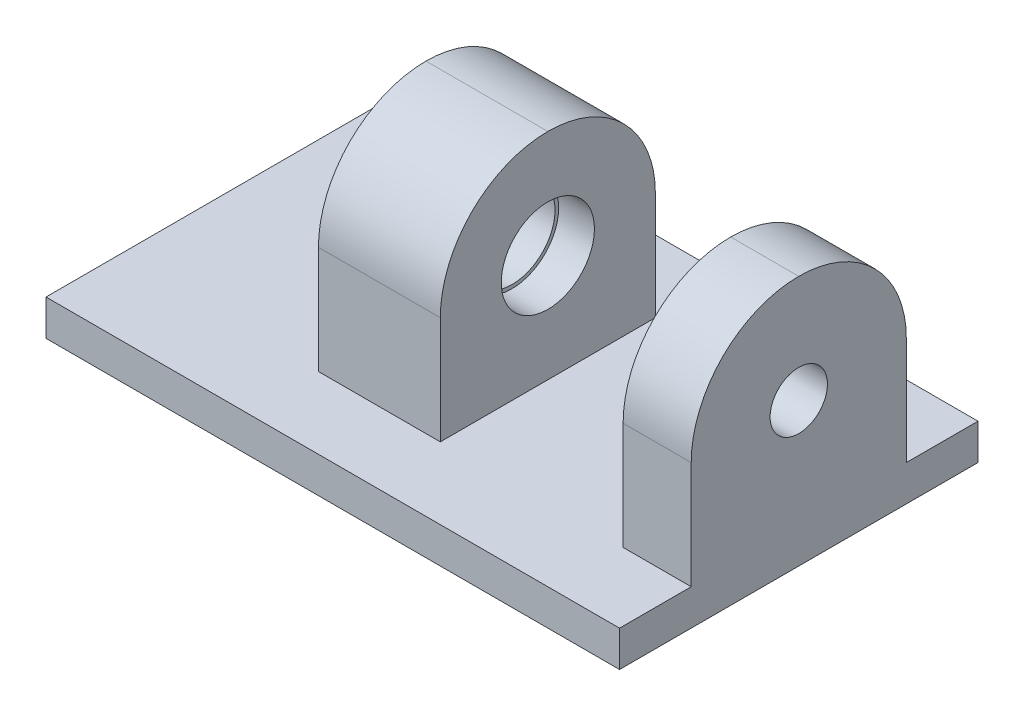
ISO-10303-21;
HEADER;
FILE_DESCRIPTION(('STEP AP214'),'2;1');
FILE_NAME('part.step','',(''),(''),'','','');
FILE_SCHEMA(('AUTOMOTIVE_DESIGN { 1 0 10303 214 1 1 1 1 }'));
ENDSEC;
DATA;
#1=APPLICATION_CONTEXT('core data for automotive mechanical design processes');
#2=APPLICATION_PROTOCOL_DEFINITION('international standard','automotive_design',2000,#1);
#3=PRODUCT_CONTEXT('',#1,'mechanical');
#4=PRODUCT('Part','Part','',(#3));
#5=PRODUCT_RELATED_PRODUCT_CATEGORY('part','',(#4));
#6=PRODUCT_DEFINITION_FORMATION('','',#4);
#7=PRODUCT_DEFINITION_CONTEXT('part definition',#1,'design');
#8=PRODUCT_DEFINITION('design','',#6,#7);
#9=PRODUCT_DEFINITION_SHAPE('','',#8);
#10=(LENGTH_UNIT() NAMED_UNIT(*) SI_UNIT(.MILLI.,.METRE.));
#11=(NAMED_UNIT(*) PLANE_ANGLE_UNIT() SI_UNIT($,.RADIAN.));
#12=(NAMED_UNIT(*) SI_UNIT($,.STERADIAN.) SOLID_ANGLE_UNIT());
#13=UNCERTAINTY_MEASURE_WITH_UNIT(LENGTH_MEASURE(1.E-05),#10,'distance_accuracy_value','');
#14=(GEOMETRIC_REPRESENTATION_CONTEXT(3) GLOBAL_UNCERTAINTY_ASSIGNED_CONTEXT((#13)) GLOBAL_UNIT_ASSIGNED_CONTEXT((#10,
#11,#12)) REPRESENTATION_CONTEXT('',''));
#15=CARTESIAN_POINT('',(0.,0.,0.));
#16=DIRECTION('',(0.,0.,1.));
#17=DIRECTION('',(1.,0.,0.));
#18=AXIS2_PLACEMENT_3D('',#15,#16,#17);
#19=CARTESIAN_POINT('',(0.,5.,0.));
#20=DIRECTION('',(0.,-1.,0.));
#21=DIRECTION('',(0.,0.,-1.));
#22=AXIS2_PLACEMENT_3D('',#19,#20,#21);
#23=PLANE('',#22);
#24=DIRECTION('',(0.,0.,-1.));
#25=VECTOR('',#24,1.);
#26=CARTESIAN_POINT('',(5.,5.,15.));
#27=LINE('',#26,#25);
#28=CARTESIAN_POINT('',(5.,5.,15.));
#29=VERTEX_POINT('',#28);
#30=CARTESIAN_POINT('',(5.,5.,-15.));
#31=VERTEX_POINT('',#30);
#32=EDGE_CURVE('E142',#29,#31,#27,.T.);
#33=ORIENTED_EDGE('',*,*,#32,.F.);
#34=DIRECTION('',(1.,0.,0.));
#35=VECTOR('',#34,1.);
#36=CARTESIAN_POINT('',(-12.,5.,15.));
#37=LINE('',#36,#35);
#38=CARTESIAN_POINT('',(-12.,5.,15.));
#39=VERTEX_POINT('',#38);
#40=EDGE_CURVE('E186',#39,#29,#37,.T.);
#41=ORIENTED_EDGE('',*,*,#40,.F.);
#42=DIRECTION('',(0.,0.,1.));
#43=VECTOR('',#42,1.);
#44=CARTESIAN_POINT('',(-12.,5.,15.));
#45=LINE('',#44,#43);
#46=CARTESIAN_POINT('',(-12.,5.,-15.));
#47=VERTEX_POINT('',#46);
#48=EDGE_CURVE('E183',#47,#39,#45,.T.);
#49=ORIENTED_EDGE('',*,*,#48,.F.);
#50=DIRECTION('',(-1.,0.,0.));
#51=VECTOR('',#50,1.);
#52=CARTESIAN_POINT('',(-12.,5.,-15.));
#53=LINE('',#52,#51);
#54=EDGE_CURVE('E180',#31,#47,#53,.T.);
#55=ORIENTED_EDGE('',*,*,#54,.F.);
#56=EDGE_LOOP('',(#33,#41,#49,#55));
#57=FACE_BOUND('',#56,.T.);
#58=DIRECTION('',(-1.,0.,0.));
#59=VECTOR('',#58,1.);
#60=CARTESIAN_POINT('',(30.5,5.,-15.));
#61=LINE('',#60,#59);
#62=CARTESIAN_POINT('',(40.,5.,-15.));
#63=VERTEX_POINT('',#62);
#64=CARTESIAN_POINT('',(30.5,5.,-15.));
#65=VERTEX_POINT('',#64);
#66=EDGE_CURVE('E139',#63,#65,#61,.T.);
#67=ORIENTED_EDGE('',*,*,#66,.F.);
#68=DIRECTION('',(0.,0.,-1.));
#69=VECTOR('',#68,1.);
#70=CARTESIAN_POINT('',(40.,5.,25.));
#71=LINE('',#70,#69);
#72=CARTESIAN_POINT('',(40.,5.,-25.));
#73=VERTEX_POINT('',#72);
#74=EDGE_CURVE('E146',#63,#73,#71,.T.);
#75=ORIENTED_EDGE('',*,*,#74,.T.);
#76=DIRECTION('',(-1.,0.,0.));
#77=VECTOR('',#76,1.);
#78=CARTESIAN_POINT('',(-40.,5.,-25.));
#79=LINE('',#78,#77);
#80=CARTESIAN_POINT('',(-40.,5.,-25.));
#81=VERTEX_POINT('',#80);
#82=EDGE_CURVE('E199',#73,#81,#79,.T.);
#83=ORIENTED_EDGE('',*,*,#82,.T.);
#84=DIRECTION('',(0.,0.,1.));
#85=VECTOR('',#84,1.);
#86=CARTESIAN_POINT('',(-40.,5.,25.));
#87=LINE('',#86,#85);
#88=CARTESIAN_POINT('',(-40.,5.,25.));
#89=VERTEX_POINT('',#88);
#90=EDGE_CURVE('E201',#81,#89,#87,.T.);
#91=ORIENTED_EDGE('',*,*,#90,.T.);
#92=DIRECTION('',(1.,0.,0.));
#93=VECTOR('',#92,1.);
#94=CARTESIAN_POINT('',(-40.,5.,25.));
#95=LINE('',#94,#93);
#96=CARTESIAN_POINT('',(40.,5.,25.));
#97=VERTEX_POINT('',#96);
#98=EDGE_CURVE('E203',#89,#97,#95,.T.);
#99=ORIENTED_EDGE('',*,*,#98,.T.);
#100=CARTESIAN_POINT('',(40.,5.,15.));
#101=VERTEX_POINT('',#100);
#102=EDGE_CURVE('E153',#97,#101,#71,.T.);
#103=ORIENTED_EDGE('',*,*,#102,.T.);
#104=DIRECTION('',(1.,0.,0.));
#105=VECTOR('',#104,1.);
#106=CARTESIAN_POINT('',(30.5,5.,15.));
#107=LINE('',#106,#105);
#108=CARTESIAN_POINT('',(30.5,5.,15.));
#109=VERTEX_POINT('',#108);
#110=EDGE_CURVE('E162',#109,#101,#107,.T.);
#111=ORIENTED_EDGE('',*,*,#110,.F.);
#112=DIRECTION('',(0.,0.,1.));
#113=VECTOR('',#112,1.);
#114=CARTESIAN_POINT('',(30.5,5.,15.));
#115=LINE('',#114,#113);
#116=EDGE_CURVE('E159',#65,#109,#115,.T.);
#117=ORIENTED_EDGE('',*,*,#116,.F.);
#118=EDGE_LOOP('',(#67,#75,#83,#91,#99,#103,#111,#117));
#119=FACE_BOUND('',#118,.T.);
#120=ADVANCED_FACE('F35',(#57,#119),#23,.F.);
#121=CARTESIAN_POINT('',(40.,5.,25.));
#122=DIRECTION('',(-1.,0.,0.));
#123=DIRECTION('',(0.,0.,1.));
#124=AXIS2_PLACEMENT_3D('',#121,#122,#123);
#125=PLANE('',#124);
#126=CARTESIAN_POINT('',(40.,20.,0.));
#127=DIRECTION('',(-1.,0.,0.));
#128=DIRECTION('',(0.,0.,1.));
#129=AXIS2_PLACEMENT_3D('',#126,#127,#128);
#130=CIRCLE('',#129,4.);
#131=CARTESIAN_POINT('',(40.,20.,3.99999999999999));
#132=VERTEX_POINT('',#131);
#133=EDGE_CURVE('E168',#132,#132,#130,.T.);
#134=ORIENTED_EDGE('',*,*,#133,.T.);
#135=EDGE_LOOP('',(#134));
#136=FACE_BOUND('',#135,.T.);
#137=DIRECTION('',(0.,-1.,0.));
#138=VECTOR('',#137,1.);
#139=CARTESIAN_POINT('',(40.,35.,-15.));
#140=LINE('',#139,#138);
#141=CARTESIAN_POINT('',(40.,20.,-15.));
#142=VERTEX_POINT('',#141);
#143=EDGE_CURVE('E134',#142,#63,#140,.T.);
#144=ORIENTED_EDGE('',*,*,#143,.F.);
#145=CARTESIAN_POINT('',(40.,20.,0.));
#146=DIRECTION('',(-1.,0.,0.));
#147=DIRECTION('',(0.,0.,1.));
#148=AXIS2_PLACEMENT_3D('',#145,#146,#147);
#149=CIRCLE('',#148,15.);
#150=CARTESIAN_POINT('',(40.,35.,0.));
#151=VERTEX_POINT('',#150);
#152=EDGE_CURVE('E44',#142,#151,#149,.F.);
#153=ORIENTED_EDGE('',*,*,#152,.T.);
#154=CARTESIAN_POINT('',(40.,20.,0.));
#155=DIRECTION('',(-1.,0.,0.));
#156=DIRECTION('',(0.,0.,1.));
#157=AXIS2_PLACEMENT_3D('',#154,#155,#156);
#158=CIRCLE('',#157,15.);
#159=CARTESIAN_POINT('',(40.,20.,15.));
#160=VERTEX_POINT('',#159);
#161=EDGE_CURVE('E52',#151,#160,#158,.F.);
#162=ORIENTED_EDGE('',*,*,#161,.T.);
#163=DIRECTION('',(0.,-1.,0.));
#164=VECTOR('',#163,1.);
#165=CARTESIAN_POINT('',(40.,35.,15.));
#166=LINE('',#165,#164);
#167=EDGE_CURVE('E173',#160,#101,#166,.T.);
#168=ORIENTED_EDGE('',*,*,#167,.T.);
#169=ORIENTED_EDGE('',*,*,#102,.F.);
#170=DIRECTION('',(0.,-1.,0.));
#171=VECTOR('',#170,1.);
#172=CARTESIAN_POINT('',(40.,5.,25.));
#173=LINE('',#172,#171);
#174=CARTESIAN_POINT('',(40.,0.,25.));
#175=VERTEX_POINT('',#174);
#176=EDGE_CURVE('E205',#97,#175,#173,.T.);
#177=ORIENTED_EDGE('',*,*,#176,.T.);
#178=DIRECTION('',(0.,0.,-1.));
#179=VECTOR('',#178,1.);
#180=CARTESIAN_POINT('',(40.,0.,25.));
#181=LINE('',#180,#179);
#182=CARTESIAN_POINT('',(40.,0.,-25.));
#183=VERTEX_POINT('',#182);
#184=EDGE_CURVE('E196',#175,#183,#181,.T.);
#185=ORIENTED_EDGE('',*,*,#184,.T.);
#186=DIRECTION('',(0.,-1.,0.));
#187=VECTOR('',#186,1.);
#188=CARTESIAN_POINT('',(40.,5.,-25.));
#189=LINE('',#188,#187);
#190=EDGE_CURVE('E150',#73,#183,#189,.T.);
#191=ORIENTED_EDGE('',*,*,#190,.F.);
#192=ORIENTED_EDGE('',*,*,#74,.F.);
#193=EDGE_LOOP('',(#144,#153,#162,#168,#169,#177,#185,#191,#192));
#194=FACE_BOUND('',#193,.T.);
#195=ADVANCED_FACE('F147',(#136,#194),#125,.F.);
#196=CARTESIAN_POINT('',(-40.,5.,-25.));
#197=DIRECTION('',(0.,0.,1.));
#198=DIRECTION('',(1.,0.,0.));
#199=AXIS2_PLACEMENT_3D('',#196,#197,#198);
#200=PLANE('',#199);
#201=DIRECTION('',(-1.,0.,0.));
#202=VECTOR('',#201,1.);
#203=CARTESIAN_POINT('',(-40.,0.,-25.));
#204=LINE('',#203,#202);
#205=CARTESIAN_POINT('',(-40.,0.,-25.));
#206=VERTEX_POINT('',#205);
#207=EDGE_CURVE('E207',#183,#206,#204,.T.);
#208=ORIENTED_EDGE('',*,*,#207,.T.);
#209=DIRECTION('',(0.,-1.,0.));
#210=VECTOR('',#209,1.);
#211=CARTESIAN_POINT('',(-40.,5.,-25.));
#212=LINE('',#211,#210);
#213=EDGE_CURVE('E217',#81,#206,#212,.T.);
#214=ORIENTED_EDGE('',*,*,#213,.F.);
#215=ORIENTED_EDGE('',*,*,#82,.F.);
#216=ORIENTED_EDGE('',*,*,#190,.T.);
#217=EDGE_LOOP('',(#208,#214,#215,#216));
#218=FACE_BOUND('',#217,.T.);
#219=ADVANCED_FACE('F325',(#218),#200,.F.);
#220=CARTESIAN_POINT('',(-40.,5.,25.));
#221=DIRECTION('',(1.,0.,0.));
#222=DIRECTION('',(0.,0.,-1.));
#223=AXIS2_PLACEMENT_3D('',#220,#221,#222);
#224=PLANE('',#223);
#225=DIRECTION('',(0.,0.,1.));
#226=VECTOR('',#225,1.);
#227=CARTESIAN_POINT('',(-40.,0.,25.));
#228=LINE('',#227,#226);
#229=CARTESIAN_POINT('',(-40.,0.,25.));
#230=VERTEX_POINT('',#229);
#231=EDGE_CURVE('E209',#206,#230,#228,.T.);
#232=ORIENTED_EDGE('',*,*,#231,.T.);
#233=DIRECTION('',(0.,-1.,0.));
#234=VECTOR('',#233,1.);
#235=CARTESIAN_POINT('',(-40.,5.,25.));
#236=LINE('',#235,#234);
#237=EDGE_CURVE('E214',#89,#230,#236,.T.);
#238=ORIENTED_EDGE('',*,*,#237,.F.);
#239=ORIENTED_EDGE('',*,*,#90,.F.);
#240=ORIENTED_EDGE('',*,*,#213,.T.);
#241=EDGE_LOOP('',(#232,#238,#239,#240));
#242=FACE_BOUND('',#241,.T.);
#243=ADVANCED_FACE('F335',(#242),#224,.F.);
#244=CARTESIAN_POINT('',(-40.,5.,25.));
#245=DIRECTION('',(0.,0.,-1.));
#246=DIRECTION('',(-1.,0.,0.));
#247=AXIS2_PLACEMENT_3D('',#244,#245,#246);
#248=PLANE('',#247);
#249=DIRECTION('',(1.,0.,0.));
#250=VECTOR('',#249,1.);
#251=CARTESIAN_POINT('',(-40.,0.,25.));
#252=LINE('',#251,#250);
#253=EDGE_CURVE('E154',#230,#175,#252,.T.);
#254=ORIENTED_EDGE('',*,*,#253,.T.);
#255=ORIENTED_EDGE('',*,*,#176,.F.);
#256=ORIENTED_EDGE('',*,*,#98,.F.);
#257=ORIENTED_EDGE('',*,*,#237,.T.);
#258=EDGE_LOOP('',(#254,#255,#256,#257));
#259=FACE_BOUND('',#258,.T.);
#260=ADVANCED_FACE('F331',(#259),#248,.F.);
#261=CARTESIAN_POINT('',(0.,0.,0.));
#262=DIRECTION('',(0.,-1.,0.));
#263=DIRECTION('',(0.,0.,-1.));
#264=AXIS2_PLACEMENT_3D('',#261,#262,#263);
#265=PLANE('',#264);
#266=ORIENTED_EDGE('',*,*,#184,.F.);
#267=ORIENTED_EDGE('',*,*,#253,.F.);
#268=ORIENTED_EDGE('',*,*,#231,.F.);
#269=ORIENTED_EDGE('',*,*,#207,.F.);
#270=EDGE_LOOP('',(#266,#267,#268,#269));
#271=FACE_BOUND('',#270,.T.);
#272=ADVANCED_FACE('F284',(#271),#265,.T.);
#273=CARTESIAN_POINT('',(5.,35.,15.));
#274=DIRECTION('',(-1.,0.,0.));
#275=DIRECTION('',(0.,0.,1.));
#276=AXIS2_PLACEMENT_3D('',#273,#274,#275);
#277=PLANE('',#276);
#278=CARTESIAN_POINT('',(5.,20.,0.));
#279=DIRECTION('',(1.,0.,0.));
#280=DIRECTION('',(0.,0.,-1.));
#281=AXIS2_PLACEMENT_3D('',#278,#279,#280);
#282=CIRCLE('',#281,6.5);
#283=CARTESIAN_POINT('',(5.,20.,-6.5));
#284=VERTEX_POINT('',#283);
#285=EDGE_CURVE('E253',#284,#284,#282,.T.);
#286=ORIENTED_EDGE('',*,*,#285,.F.);
#287=EDGE_LOOP('',(#286));
#288=FACE_BOUND('',#287,.T.);
#289=DIRECTION('',(0.,-1.,0.));
#290=VECTOR('',#289,1.);
#291=CARTESIAN_POINT('',(5.,35.,-15.));
#292=LINE('',#291,#290);
#293=CARTESIAN_POINT('',(5.,20.,-15.));
#294=VERTEX_POINT('',#293);
#295=EDGE_CURVE('E195',#294,#31,#292,.T.);
#296=ORIENTED_EDGE('',*,*,#295,.F.);
#297=CARTESIAN_POINT('',(5.,20.,0.));
#298=DIRECTION('',(-1.,0.,0.));
#299=DIRECTION('',(0.,0.,1.));
#300=AXIS2_PLACEMENT_3D('',#297,#298,#299);
#301=CIRCLE('',#300,15.);
#302=CARTESIAN_POINT('',(5.,35.,0.));
#303=VERTEX_POINT('',#302);
#304=EDGE_CURVE('E230',#294,#303,#301,.F.);
#305=ORIENTED_EDGE('',*,*,#304,.T.);
#306=CARTESIAN_POINT('',(5.,20.,0.));
#307=DIRECTION('',(-1.,0.,0.));
#308=DIRECTION('',(0.,0.,1.));
#309=AXIS2_PLACEMENT_3D('',#306,#307,#308);
#310=CIRCLE('',#309,15.);
#311=CARTESIAN_POINT('',(5.,20.,15.));
#312=VERTEX_POINT('',#311);
#313=EDGE_CURVE('E228',#303,#312,#310,.F.);
#314=ORIENTED_EDGE('',*,*,#313,.T.);
#315=DIRECTION('',(0.,-1.,0.));
#316=VECTOR('',#315,1.);
#317=CARTESIAN_POINT('',(5.,35.,15.));
#318=LINE('',#317,#316);
#319=EDGE_CURVE('E189',#312,#29,#318,.T.);
#320=ORIENTED_EDGE('',*,*,#319,.T.);
#321=ORIENTED_EDGE('',*,*,#32,.T.);
#322=EDGE_LOOP('',(#296,#305,#314,#320,#321));
#323=FACE_BOUND('',#322,.T.);
#324=ADVANCED_FACE('F280',(#288,#323),#277,.F.);
#325=CARTESIAN_POINT('',(-12.,35.,-15.));
#326=DIRECTION('',(0.,0.,1.));
#327=DIRECTION('',(1.,0.,0.));
#328=AXIS2_PLACEMENT_3D('',#325,#326,#327);
#329=PLANE('',#328);
#330=DIRECTION('',(0.,-1.,0.));
#331=VECTOR('',#330,1.);
#332=CARTESIAN_POINT('',(-12.,35.,-15.));
#333=LINE('',#332,#331);
#334=CARTESIAN_POINT('',(-12.,20.,-15.));
#335=VERTEX_POINT('',#334);
#336=EDGE_CURVE('E193',#335,#47,#333,.T.);
#337=ORIENTED_EDGE('',*,*,#336,.F.);
#338=DIRECTION('',(-1.,0.,0.));
#339=VECTOR('',#338,1.);
#340=CARTESIAN_POINT('',(-12.,20.,-15.));
#341=LINE('',#340,#339);
#342=EDGE_CURVE('E225',#335,#294,#341,.F.);
#343=ORIENTED_EDGE('',*,*,#342,.T.);
#344=ORIENTED_EDGE('',*,*,#295,.T.);
#345=ORIENTED_EDGE('',*,*,#54,.T.);
#346=EDGE_LOOP('',(#337,#343,#344,#345));
#347=FACE_BOUND('',#346,.T.);
#348=ADVANCED_FACE('F283',(#347),#329,.F.);
#349=CARTESIAN_POINT('',(-12.,35.,15.));
#350=DIRECTION('',(1.,0.,0.));
#351=DIRECTION('',(0.,0.,-1.));
#352=AXIS2_PLACEMENT_3D('',#349,#350,#351);
#353=PLANE('',#352);
#354=CARTESIAN_POINT('',(-12.,20.,0.));
#355=DIRECTION('',(-1.,0.,0.));
#356=DIRECTION('',(0.,0.,1.));
#357=AXIS2_PLACEMENT_3D('',#354,#355,#356);
#358=CIRCLE('',#357,6.);
#359=CARTESIAN_POINT('',(-12.,20.,6.));
#360=VERTEX_POINT('',#359);
#361=EDGE_CURVE('E258',#360,#360,#358,.T.);
#362=ORIENTED_EDGE('',*,*,#361,.F.);
#363=EDGE_LOOP('',(#362));
#364=FACE_BOUND('',#363,.T.);
#365=CARTESIAN_POINT('',(-12.,20.,0.));
#366=DIRECTION('',(1.,0.,0.));
#367=DIRECTION('',(0.,0.,-1.));
#368=AXIS2_PLACEMENT_3D('',#365,#366,#367);
#369=CIRCLE('',#368,15.);
#370=CARTESIAN_POINT('',(-12.,20.,15.));
#371=VERTEX_POINT('',#370);
#372=CARTESIAN_POINT('',(-12.,35.,0.));
#373=VERTEX_POINT('',#372);
#374=EDGE_CURVE('E221',#371,#373,#369,.F.);
#375=ORIENTED_EDGE('',*,*,#374,.T.);
#376=CARTESIAN_POINT('',(-12.,20.,0.));
#377=DIRECTION('',(1.,0.,0.));
#378=DIRECTION('',(0.,0.,-1.));
#379=AXIS2_PLACEMENT_3D('',#376,#377,#378);
#380=CIRCLE('',#379,15.);
#381=EDGE_CURVE('E223',#373,#335,#380,.F.);
#382=ORIENTED_EDGE('',*,*,#381,.T.);
#383=ORIENTED_EDGE('',*,*,#336,.T.);
#384=ORIENTED_EDGE('',*,*,#48,.T.);
#385=DIRECTION('',(0.,-1.,0.));
#386=VECTOR('',#385,1.);
#387=CARTESIAN_POINT('',(-12.,35.,15.));
#388=LINE('',#387,#386);
#389=EDGE_CURVE('E191',#371,#39,#388,.T.);
#390=ORIENTED_EDGE('',*,*,#389,.F.);
#391=EDGE_LOOP('',(#375,#382,#383,#384,#390));
#392=FACE_BOUND('',#391,.T.);
#393=ADVANCED_FACE('F298',(#364,#392),#353,.F.);
#394=CARTESIAN_POINT('',(-12.,35.,15.));
#395=DIRECTION('',(0.,0.,-1.));
#396=DIRECTION('',(-1.,0.,0.));
#397=AXIS2_PLACEMENT_3D('',#394,#395,#396);
#398=PLANE('',#397);
#399=ORIENTED_EDGE('',*,*,#319,.F.);
#400=DIRECTION('',(1.,0.,0.));
#401=VECTOR('',#400,1.);
#402=CARTESIAN_POINT('',(-12.,20.,15.));
#403=LINE('',#402,#401);
#404=EDGE_CURVE('E232',#312,#371,#403,.F.);
#405=ORIENTED_EDGE('',*,*,#404,.T.);
#406=ORIENTED_EDGE('',*,*,#389,.T.);
#407=ORIENTED_EDGE('',*,*,#40,.T.);
#408=EDGE_LOOP('',(#399,#405,#406,#407));
#409=FACE_BOUND('',#408,.T.);
#410=ADVANCED_FACE('F309',(#409),#398,.F.);
#411=CARTESIAN_POINT('',(30.5,35.,-15.));
#412=DIRECTION('',(0.,0.,1.));
#413=DIRECTION('',(1.,0.,0.));
#414=AXIS2_PLACEMENT_3D('',#411,#412,#413);
#415=PLANE('',#414);
#416=DIRECTION('',(0.,-1.,0.));
#417=VECTOR('',#416,1.);
#418=CARTESIAN_POINT('',(30.5,35.,-15.));
#419=LINE('',#418,#417);
#420=CARTESIAN_POINT('',(30.5,20.,-15.));
#421=VERTEX_POINT('',#420);
#422=EDGE_CURVE('E143',#421,#65,#419,.T.);
#423=ORIENTED_EDGE('',*,*,#422,.F.);
#424=DIRECTION('',(-1.,0.,0.));
#425=VECTOR('',#424,1.);
#426=CARTESIAN_POINT('',(30.5,20.,-15.));
#427=LINE('',#426,#425);
#428=EDGE_CURVE('E141',#421,#142,#427,.F.);
#429=ORIENTED_EDGE('',*,*,#428,.T.);
#430=ORIENTED_EDGE('',*,*,#143,.T.);
#431=ORIENTED_EDGE('',*,*,#66,.T.);
#432=EDGE_LOOP('',(#423,#429,#430,#431));
#433=FACE_BOUND('',#432,.T.);
#434=ADVANCED_FACE('F137',(#433),#415,.F.);
#435=CARTESIAN_POINT('',(30.5,35.,15.));
#436=DIRECTION('',(1.,0.,0.));
#437=DIRECTION('',(0.,0.,-1.));
#438=AXIS2_PLACEMENT_3D('',#435,#436,#437);
#439=PLANE('',#438);
#440=CARTESIAN_POINT('',(30.5,20.,0.));
#441=DIRECTION('',(-1.,0.,0.));
#442=DIRECTION('',(0.,0.,1.));
#443=AXIS2_PLACEMENT_3D('',#440,#441,#442);
#444=CIRCLE('',#443,4.);
#445=CARTESIAN_POINT('',(30.5,20.,3.99999999999999));
#446=VERTEX_POINT('',#445);
#447=EDGE_CURVE('E245',#446,#446,#444,.T.);
#448=ORIENTED_EDGE('',*,*,#447,.F.);
#449=EDGE_LOOP('',(#448));
#450=FACE_BOUND('',#449,.T.);
#451=CARTESIAN_POINT('',(30.5,20.,0.));
#452=DIRECTION('',(1.,0.,0.));
#453=DIRECTION('',(0.,0.,-1.));
#454=AXIS2_PLACEMENT_3D('',#451,#452,#453);
#455=CIRCLE('',#454,15.);
#456=CARTESIAN_POINT('',(30.5,20.,15.));
#457=VERTEX_POINT('',#456);
#458=CARTESIAN_POINT('',(30.5,35.,0.));
#459=VERTEX_POINT('',#458);
#460=EDGE_CURVE('E234',#457,#459,#455,.F.);
#461=ORIENTED_EDGE('',*,*,#460,.T.);
#462=CARTESIAN_POINT('',(30.5,20.,0.));
#463=DIRECTION('',(1.,0.,0.));
#464=DIRECTION('',(0.,0.,-1.));
#465=AXIS2_PLACEMENT_3D('',#462,#463,#464);
#466=CIRCLE('',#465,15.);
#467=EDGE_CURVE('E236',#459,#421,#466,.F.);
#468=ORIENTED_EDGE('',*,*,#467,.T.);
#469=ORIENTED_EDGE('',*,*,#422,.T.);
#470=ORIENTED_EDGE('',*,*,#116,.T.);
#471=DIRECTION('',(0.,-1.,0.));
#472=VECTOR('',#471,1.);
#473=CARTESIAN_POINT('',(30.5,35.,15.));
#474=LINE('',#473,#472);
#475=EDGE_CURVE('E175',#457,#109,#474,.T.);
#476=ORIENTED_EDGE('',*,*,#475,.F.);
#477=EDGE_LOOP('',(#461,#468,#469,#470,#476));
#478=FACE_BOUND('',#477,.T.);
#479=ADVANCED_FACE('F316',(#450,#478),#439,.F.);
#480=CARTESIAN_POINT('',(30.5,35.,15.));
#481=DIRECTION('',(0.,0.,-1.));
#482=DIRECTION('',(-1.,0.,0.));
#483=AXIS2_PLACEMENT_3D('',#480,#481,#482);
#484=PLANE('',#483);
#485=ORIENTED_EDGE('',*,*,#167,.F.);
#486=DIRECTION('',(1.,0.,0.));
#487=VECTOR('',#486,1.);
#488=CARTESIAN_POINT('',(30.5,20.,15.));
#489=LINE('',#488,#487);
#490=EDGE_CURVE('E11',#160,#457,#489,.F.);
#491=ORIENTED_EDGE('',*,*,#490,.T.);
#492=ORIENTED_EDGE('',*,*,#475,.T.);
#493=ORIENTED_EDGE('',*,*,#110,.T.);
#494=EDGE_LOOP('',(#485,#491,#492,#493));
#495=FACE_BOUND('',#494,.T.);
#496=ADVANCED_FACE('F346',(#495),#484,.F.);
#497=CARTESIAN_POINT('',(0.,20.,0.));
#498=DIRECTION('',(1.,0.,0.));
#499=DIRECTION('',(0.,0.,-1.));
#500=AXIS2_PLACEMENT_3D('',#497,#498,#499);
#501=CYLINDRICAL_SURFACE('',#500,15.);
#502=ORIENTED_EDGE('',*,*,#404,.F.);
#503=ORIENTED_EDGE('',*,*,#313,.F.);
#504=DIRECTION('',(1.,0.,0.));
#505=VECTOR('',#504,1.);
#506=CARTESIAN_POINT('',(0.,35.,0.));
#507=LINE('',#506,#505);
#508=EDGE_CURVE('E160',#373,#303,#507,.T.);
#509=ORIENTED_EDGE('',*,*,#508,.F.);
#510=ORIENTED_EDGE('',*,*,#374,.F.);
#511=EDGE_LOOP('',(#502,#503,#509,#510));
#512=FACE_BOUND('',#511,.T.);
#513=ADVANCED_FACE('F306',(#512),#501,.T.);
#514=CARTESIAN_POINT('',(0.,20.,0.));
#515=DIRECTION('',(-1.,0.,0.));
#516=DIRECTION('',(0.,0.,1.));
#517=AXIS2_PLACEMENT_3D('',#514,#515,#516);
#518=CYLINDRICAL_SURFACE('',#517,15.);
#519=ORIENTED_EDGE('',*,*,#304,.F.);
#520=ORIENTED_EDGE('',*,*,#342,.F.);
#521=ORIENTED_EDGE('',*,*,#381,.F.);
#522=ORIENTED_EDGE('',*,*,#508,.T.);
#523=EDGE_LOOP('',(#519,#520,#521,#522));
#524=FACE_BOUND('',#523,.T.);
#525=ADVANCED_FACE('F302',(#524),#518,.T.);
#526=CARTESIAN_POINT('',(0.,20.,0.));
#527=DIRECTION('',(1.,0.,0.));
#528=DIRECTION('',(0.,0.,-1.));
#529=AXIS2_PLACEMENT_3D('',#526,#527,#528);
#530=CYLINDRICAL_SURFACE('',#529,15.);
#531=ORIENTED_EDGE('',*,*,#490,.F.);
#532=ORIENTED_EDGE('',*,*,#161,.F.);
#533=DIRECTION('',(1.,0.,0.));
#534=VECTOR('',#533,1.);
#535=CARTESIAN_POINT('',(0.,35.,0.));
#536=LINE('',#535,#534);
#537=EDGE_CURVE('E165',#459,#151,#536,.T.);
#538=ORIENTED_EDGE('',*,*,#537,.F.);
#539=ORIENTED_EDGE('',*,*,#460,.F.);
#540=EDGE_LOOP('',(#531,#532,#538,#539));
#541=FACE_BOUND('',#540,.T.);
#542=ADVANCED_FACE('F37',(#541),#530,.T.);
#543=CARTESIAN_POINT('',(0.,20.,0.));
#544=DIRECTION('',(-1.,0.,0.));
#545=DIRECTION('',(0.,0.,1.));
#546=AXIS2_PLACEMENT_3D('',#543,#544,#545);
#547=CYLINDRICAL_SURFACE('',#546,15.);
#548=ORIENTED_EDGE('',*,*,#152,.F.);
#549=ORIENTED_EDGE('',*,*,#428,.F.);
#550=ORIENTED_EDGE('',*,*,#467,.F.);
#551=ORIENTED_EDGE('',*,*,#537,.T.);
#552=EDGE_LOOP('',(#548,#549,#550,#551));
#553=FACE_BOUND('',#552,.T.);
#554=ADVANCED_FACE('F347',(#553),#547,.T.);
#555=CARTESIAN_POINT('',(60.5,20.,0.));
#556=DIRECTION('',(-1.,0.,0.));
#557=DIRECTION('',(0.,0.,1.));
#558=AXIS2_PLACEMENT_3D('',#555,#556,#557);
#559=CYLINDRICAL_SURFACE('',#558,4.);
#560=ORIENTED_EDGE('',*,*,#447,.T.);
#561=EDGE_LOOP('',(#560));
#562=FACE_BOUND('',#561,.T.);
#563=ORIENTED_EDGE('',*,*,#133,.F.);
#564=EDGE_LOOP('',(#563));
#565=FACE_BOUND('',#564,.T.);
#566=ADVANCED_FACE('F276',(#562,#565),#559,.F.);
#567=CARTESIAN_POINT('',(0.,20.,0.));
#568=DIRECTION('',(1.,0.,0.));
#569=DIRECTION('',(0.,0.,-1.));
#570=AXIS2_PLACEMENT_3D('',#567,#568,#569);
#571=CYLINDRICAL_SURFACE('',#570,6.5);
#572=CARTESIAN_POINT('',(0.,20.,0.));
#573=DIRECTION('',(1.,0.,0.));
#574=DIRECTION('',(0.,0.,-1.));
#575=AXIS2_PLACEMENT_3D('',#572,#573,#574);
#576=CIRCLE('',#575,6.5);
#577=CARTESIAN_POINT('',(0.,20.,-6.5));
#578=VERTEX_POINT('',#577);
#579=EDGE_CURVE('E249',#578,#578,#576,.T.);
#580=ORIENTED_EDGE('',*,*,#579,.F.);
#581=EDGE_LOOP('',(#580));
#582=FACE_BOUND('',#581,.T.);
#583=ORIENTED_EDGE('',*,*,#285,.T.);
#584=EDGE_LOOP('',(#583));
#585=FACE_BOUND('',#584,.T.);
#586=ADVANCED_FACE('F270',(#582,#585),#571,.F.);
#587=CARTESIAN_POINT('',(0.,20.,0.));
#588=DIRECTION('',(1.,0.,0.));
#589=DIRECTION('',(0.,0.,-1.));
#590=AXIS2_PLACEMENT_3D('',#587,#588,#589);
#591=PLANE('',#590);
#592=CARTESIAN_POINT('',(0.,20.,0.));
#593=DIRECTION('',(1.,0.,0.));
#594=DIRECTION('',(0.,0.,-1.));
#595=AXIS2_PLACEMENT_3D('',#592,#593,#594);
#596=CIRCLE('',#595,6.);
#597=CARTESIAN_POINT('',(0.,20.,-6.));
#598=VERTEX_POINT('',#597);
#599=EDGE_CURVE('E39',#598,#598,#596,.T.);
#600=ORIENTED_EDGE('',*,*,#599,.F.);
#601=EDGE_LOOP('',(#600));
#602=FACE_BOUND('',#601,.T.);
#603=ORIENTED_EDGE('',*,*,#579,.T.);
#604=EDGE_LOOP('',(#603));
#605=FACE_BOUND('',#604,.T.);
#606=ADVANCED_FACE('F267',(#602,#605),#591,.T.);
#607=CARTESIAN_POINT('',(2.,20.,0.));
#608=DIRECTION('',(-1.,0.,0.));
#609=DIRECTION('',(0.,0.,1.));
#610=AXIS2_PLACEMENT_3D('',#607,#608,#609);
#611=CYLINDRICAL_SURFACE('',#610,6.);
#612=ORIENTED_EDGE('',*,*,#599,.T.);
#613=EDGE_LOOP('',(#612));
#614=FACE_BOUND('',#613,.T.);
#615=ORIENTED_EDGE('',*,*,#361,.T.);
#616=EDGE_LOOP('',(#615));
#617=FACE_BOUND('',#616,.T.);
#618=ADVANCED_FACE('F265',(#614,#617),#611,.F.);
#619=CLOSED_SHELL('',(#120,#195,#219,#243,#260,#272,#324,#348,#393,#410,#434,#479,#496,#513,
#525,#542,#554,#566,#586,#606,#618));
#620=MANIFOLD_SOLID_BREP('B2',#619);
#621=ADVANCED_BREP_SHAPE_REPRESENTATION('',(#18,#620),#14);
#622=SHAPE_DEFINITION_REPRESENTATION(#9,#621);
ENDSEC;
END-ISO-10303-21;
